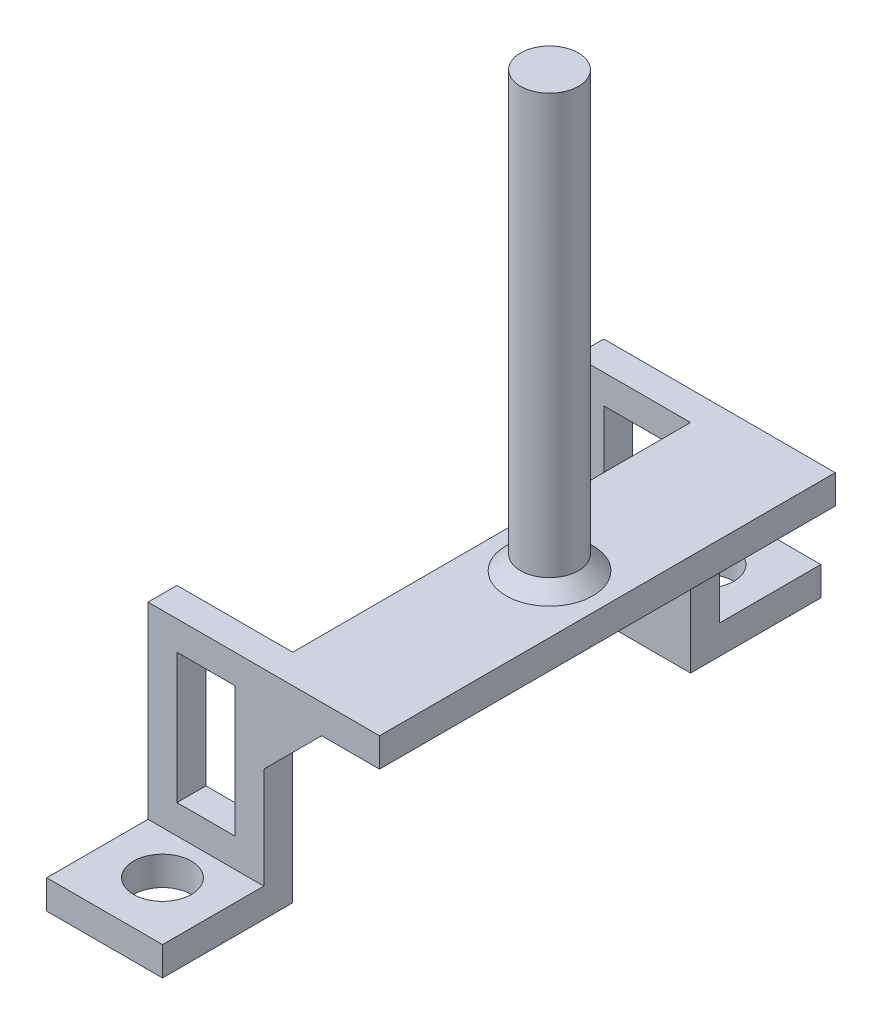
ISO-10303-21;
HEADER;
FILE_DESCRIPTION(('STEP AP214'),'2;1');
FILE_NAME('part.step','',(''),(''),'','','');
FILE_SCHEMA(('AUTOMOTIVE_DESIGN { 1 0 10303 214 1 1 1 1 }'));
ENDSEC;
DATA;
#1=APPLICATION_CONTEXT('core data for automotive mechanical design processes');
#2=APPLICATION_PROTOCOL_DEFINITION('international standard','automotive_design',2000,#1);
#3=PRODUCT_CONTEXT('',#1,'mechanical');
#4=PRODUCT('Part','Part','',(#3));
#5=PRODUCT_RELATED_PRODUCT_CATEGORY('part','',(#4));
#6=PRODUCT_DEFINITION_FORMATION('','',#4);
#7=PRODUCT_DEFINITION_CONTEXT('part definition',#1,'design');
#8=PRODUCT_DEFINITION('design','',#6,#7);
#9=PRODUCT_DEFINITION_SHAPE('','',#8);
#10=(LENGTH_UNIT() NAMED_UNIT(*) SI_UNIT(.MILLI.,.METRE.));
#11=(NAMED_UNIT(*) PLANE_ANGLE_UNIT() SI_UNIT($,.RADIAN.));
#12=(NAMED_UNIT(*) SI_UNIT($,.STERADIAN.) SOLID_ANGLE_UNIT());
#13=UNCERTAINTY_MEASURE_WITH_UNIT(LENGTH_MEASURE(1.E-05),#10,'distance_accuracy_value','');
#14=(GEOMETRIC_REPRESENTATION_CONTEXT(3) GLOBAL_UNCERTAINTY_ASSIGNED_CONTEXT((#13)) GLOBAL_UNIT_ASSIGNED_CONTEXT((#10,
#11,#12)) REPRESENTATION_CONTEXT('',''));
#15=CARTESIAN_POINT('',(0.,0.,0.));
#16=DIRECTION('',(0.,0.,1.));
#17=DIRECTION('',(1.,0.,0.));
#18=AXIS2_PLACEMENT_3D('',#15,#16,#17);
#19=CARTESIAN_POINT('',(4.,2.,-4.));
#20=DIRECTION('',(-1.,0.,0.));
#21=DIRECTION('',(0.,0.,1.));
#22=AXIS2_PLACEMENT_3D('',#19,#20,#21);
#23=PLANE('',#22);
#24=DIRECTION('',(0.,-1.,0.));
#25=VECTOR('',#24,1.);
#26=CARTESIAN_POINT('',(4.,15.,-5.));
#27=LINE('',#26,#25);
#28=CARTESIAN_POINT('',(4.,9.00000000000001,-5.));
#29=VERTEX_POINT('',#28);
#30=CARTESIAN_POINT('',(4.,0.,-5.));
#31=VERTEX_POINT('',#30);
#32=EDGE_CURVE('E348',#29,#31,#27,.T.);
#33=ORIENTED_EDGE('',*,*,#32,.F.);
#34=DIRECTION('',(0.,0.,1.));
#35=VECTOR('',#34,1.);
#36=CARTESIAN_POINT('',(4.,9.00000000000001,-3.));
#37=LINE('',#36,#35);
#38=CARTESIAN_POINT('',(4.,9.00000000000001,-3.));
#39=VERTEX_POINT('',#38);
#40=EDGE_CURVE('E392',#29,#39,#37,.T.);
#41=ORIENTED_EDGE('',*,*,#40,.T.);
#42=DIRECTION('',(0.,-1.,0.));
#43=VECTOR('',#42,1.);
#44=CARTESIAN_POINT('',(4.,15.,-3.));
#45=LINE('',#44,#43);
#46=CARTESIAN_POINT('',(4.,2.,-3.));
#47=VERTEX_POINT('',#46);
#48=EDGE_CURVE('E343',#39,#47,#45,.T.);
#49=ORIENTED_EDGE('',*,*,#48,.T.);
#50=DIRECTION('',(0.,0.,-1.));
#51=VECTOR('',#50,1.);
#52=CARTESIAN_POINT('',(4.,2.,-4.));
#53=LINE('',#52,#51);
#54=CARTESIAN_POINT('',(4.,2.,4.));
#55=VERTEX_POINT('',#54);
#56=EDGE_CURVE('E360',#55,#47,#53,.T.);
#57=ORIENTED_EDGE('',*,*,#56,.F.);
#58=DIRECTION('',(0.,-1.,0.));
#59=VECTOR('',#58,1.);
#60=CARTESIAN_POINT('',(4.,2.,4.));
#61=LINE('',#60,#59);
#62=CARTESIAN_POINT('',(4.,0.,4.));
#63=VERTEX_POINT('',#62);
#64=EDGE_CURVE('E368',#55,#63,#61,.T.);
#65=ORIENTED_EDGE('',*,*,#64,.T.);
#66=DIRECTION('',(0.,0.,-1.));
#67=VECTOR('',#66,1.);
#68=CARTESIAN_POINT('',(4.,0.,-4.));
#69=LINE('',#68,#67);
#70=EDGE_CURVE('E357',#63,#31,#69,.T.);
#71=ORIENTED_EDGE('',*,*,#70,.T.);
#72=EDGE_LOOP('',(#33,#41,#49,#57,#65,#71));
#73=FACE_BOUND('',#72,.T.);
#74=ADVANCED_FACE('F33',(#73),#23,.F.);
#75=CARTESIAN_POINT('',(0.,2.,0.));
#76=DIRECTION('',(0.,1.,0.));
#77=DIRECTION('',(0.,0.,1.));
#78=AXIS2_PLACEMENT_3D('',#75,#76,#77);
#79=PLANE('',#78);
#80=DIRECTION('',(1.,0.,0.));
#81=VECTOR('',#80,1.);
#82=CARTESIAN_POINT('',(0.,2.,-3.));
#83=LINE('',#82,#81);
#84=CARTESIAN_POINT('',(-4.,2.,-3.));
#85=VERTEX_POINT('',#84);
#86=EDGE_CURVE('E342',#85,#47,#83,.T.);
#87=ORIENTED_EDGE('',*,*,#86,.F.);
#88=DIRECTION('',(0.,0.,1.));
#89=VECTOR('',#88,1.);
#90=CARTESIAN_POINT('',(-4.,2.,-4.));
#91=LINE('',#90,#89);
#92=CARTESIAN_POINT('',(-4.,2.,4.));
#93=VERTEX_POINT('',#92);
#94=EDGE_CURVE('E363',#85,#93,#91,.T.);
#95=ORIENTED_EDGE('',*,*,#94,.T.);
#96=DIRECTION('',(1.,0.,0.));
#97=VECTOR('',#96,1.);
#98=CARTESIAN_POINT('',(-4.,2.,4.));
#99=LINE('',#98,#97);
#100=EDGE_CURVE('E366',#93,#55,#99,.T.);
#101=ORIENTED_EDGE('',*,*,#100,.T.);
#102=ORIENTED_EDGE('',*,*,#56,.T.);
#103=EDGE_LOOP('',(#87,#95,#101,#102));
#104=FACE_BOUND('',#103,.T.);
#105=CARTESIAN_POINT('',(0.,2.,0.));
#106=DIRECTION('',(0.,1.,0.));
#107=DIRECTION('',(0.,0.,1.));
#108=AXIS2_PLACEMENT_3D('',#105,#106,#107);
#109=CIRCLE('',#108,2.);
#110=CARTESIAN_POINT('',(0.,2.,2.));
#111=VERTEX_POINT('',#110);
#112=EDGE_CURVE('E354',#111,#111,#109,.T.);
#113=ORIENTED_EDGE('',*,*,#112,.F.);
#114=EDGE_LOOP('',(#113));
#115=FACE_BOUND('',#114,.T.);
#116=ADVANCED_FACE('F426',(#104,#115),#79,.T.);
#117=CARTESIAN_POINT('',(0.,0.,0.));
#118=DIRECTION('',(0.,1.,0.));
#119=DIRECTION('',(0.,0.,1.));
#120=AXIS2_PLACEMENT_3D('',#117,#118,#119);
#121=PLANE('',#120);
#122=DIRECTION('',(1.,0.,0.));
#123=VECTOR('',#122,1.);
#124=CARTESIAN_POINT('',(-4.,0.,4.));
#125=LINE('',#124,#123);
#126=CARTESIAN_POINT('',(-4.,0.,4.));
#127=VERTEX_POINT('',#126);
#128=EDGE_CURVE('E364',#127,#63,#125,.T.);
#129=ORIENTED_EDGE('',*,*,#128,.F.);
#130=DIRECTION('',(0.,0.,1.));
#131=VECTOR('',#130,1.);
#132=CARTESIAN_POINT('',(-4.,0.,-4.));
#133=LINE('',#132,#131);
#134=CARTESIAN_POINT('',(-4.,0.,-5.));
#135=VERTEX_POINT('',#134);
#136=EDGE_CURVE('E371',#135,#127,#133,.T.);
#137=ORIENTED_EDGE('',*,*,#136,.F.);
#138=DIRECTION('',(1.,0.,0.));
#139=VECTOR('',#138,1.);
#140=CARTESIAN_POINT('',(-4.,0.,-5.));
#141=LINE('',#140,#139);
#142=EDGE_CURVE('E320',#135,#31,#141,.T.);
#143=ORIENTED_EDGE('',*,*,#142,.T.);
#144=ORIENTED_EDGE('',*,*,#70,.F.);
#145=EDGE_LOOP('',(#129,#137,#143,#144));
#146=FACE_BOUND('',#145,.T.);
#147=CARTESIAN_POINT('',(0.,0.,0.));
#148=DIRECTION('',(0.,1.,0.));
#149=DIRECTION('',(0.,0.,1.));
#150=AXIS2_PLACEMENT_3D('',#147,#148,#149);
#151=CIRCLE('',#150,2.);
#152=CARTESIAN_POINT('',(0.,0.,2.));
#153=VERTEX_POINT('',#152);
#154=EDGE_CURVE('E353',#153,#153,#151,.T.);
#155=ORIENTED_EDGE('',*,*,#154,.T.);
#156=EDGE_LOOP('',(#155));
#157=FACE_BOUND('',#156,.T.);
#158=ADVANCED_FACE('F434',(#146,#157),#121,.F.);
#159=CARTESIAN_POINT('',(-4.,2.,-4.));
#160=DIRECTION('',(1.,0.,0.));
#161=DIRECTION('',(0.,0.,-1.));
#162=AXIS2_PLACEMENT_3D('',#159,#160,#161);
#163=PLANE('',#162);
#164=ORIENTED_EDGE('',*,*,#94,.F.);
#165=DIRECTION('',(0.,-1.,0.));
#166=VECTOR('',#165,1.);
#167=CARTESIAN_POINT('',(-4.,15.,-3.));
#168=LINE('',#167,#166);
#169=CARTESIAN_POINT('',(-4.,15.,-3.));
#170=VERTEX_POINT('',#169);
#171=EDGE_CURVE('E339',#170,#85,#168,.T.);
#172=ORIENTED_EDGE('',*,*,#171,.F.);
#173=DIRECTION('',(0.,0.,-1.));
#174=VECTOR('',#173,1.);
#175=CARTESIAN_POINT('',(-4.,15.,-3.));
#176=LINE('',#175,#174);
#177=CARTESIAN_POINT('',(-4.,15.,-5.));
#178=VERTEX_POINT('',#177);
#179=EDGE_CURVE('E328',#170,#178,#176,.T.);
#180=ORIENTED_EDGE('',*,*,#179,.T.);
#181=DIRECTION('',(0.,-1.,0.));
#182=VECTOR('',#181,1.);
#183=CARTESIAN_POINT('',(-4.,15.,-5.));
#184=LINE('',#183,#182);
#185=EDGE_CURVE('E336',#178,#135,#184,.T.);
#186=ORIENTED_EDGE('',*,*,#185,.T.);
#187=ORIENTED_EDGE('',*,*,#136,.T.);
#188=DIRECTION('',(0.,-1.,0.));
#189=VECTOR('',#188,1.);
#190=CARTESIAN_POINT('',(-4.,2.,4.));
#191=LINE('',#190,#189);
#192=EDGE_CURVE('E376',#93,#127,#191,.T.);
#193=ORIENTED_EDGE('',*,*,#192,.F.);
#194=EDGE_LOOP('',(#164,#172,#180,#186,#187,#193));
#195=FACE_BOUND('',#194,.T.);
#196=ADVANCED_FACE('F440',(#195),#163,.F.);
#197=CARTESIAN_POINT('',(-4.,2.,4.));
#198=DIRECTION('',(0.,0.,-1.));
#199=DIRECTION('',(-1.,0.,0.));
#200=AXIS2_PLACEMENT_3D('',#197,#198,#199);
#201=PLANE('',#200);
#202=ORIENTED_EDGE('',*,*,#128,.T.);
#203=ORIENTED_EDGE('',*,*,#64,.F.);
#204=ORIENTED_EDGE('',*,*,#100,.F.);
#205=ORIENTED_EDGE('',*,*,#192,.T.);
#206=EDGE_LOOP('',(#202,#203,#204,#205));
#207=FACE_BOUND('',#206,.T.);
#208=ADVANCED_FACE('F503',(#207),#201,.F.);
#209=CARTESIAN_POINT('',(0.,2.,0.));
#210=DIRECTION('',(0.,-1.,0.));
#211=DIRECTION('',(0.,0.,-1.));
#212=AXIS2_PLACEMENT_3D('',#209,#210,#211);
#213=CYLINDRICAL_SURFACE('',#212,2.);
#214=ORIENTED_EDGE('',*,*,#112,.T.);
#215=EDGE_LOOP('',(#214));
#216=FACE_BOUND('',#215,.T.);
#217=ORIENTED_EDGE('',*,*,#154,.F.);
#218=EDGE_LOOP('',(#217));
#219=FACE_BOUND('',#218,.T.);
#220=ADVANCED_FACE('F507',(#216,#219),#213,.F.);
#221=CARTESIAN_POINT('',(-4.,15.,-3.));
#222=DIRECTION('',(0.,0.,1.));
#223=DIRECTION('',(1.,0.,0.));
#224=AXIS2_PLACEMENT_3D('',#221,#222,#223);
#225=PLANE('',#224);
#226=DIRECTION('',(0.,1.,0.));
#227=VECTOR('',#226,1.);
#228=CARTESIAN_POINT('',(2.,4.,-3.));
#229=LINE('',#228,#227);
#230=CARTESIAN_POINT('',(2.,4.,-3.));
#231=VERTEX_POINT('',#230);
#232=CARTESIAN_POINT('',(2.,13.,-3.));
#233=VERTEX_POINT('',#232);
#234=EDGE_CURVE('E48',#231,#233,#229,.T.);
#235=ORIENTED_EDGE('',*,*,#234,.F.);
#236=DIRECTION('',(1.,0.,0.));
#237=VECTOR('',#236,1.);
#238=CARTESIAN_POINT('',(-2.,4.,-3.));
#239=LINE('',#238,#237);
#240=CARTESIAN_POINT('',(-2.,4.,-3.));
#241=VERTEX_POINT('',#240);
#242=EDGE_CURVE('E226',#241,#231,#239,.T.);
#243=ORIENTED_EDGE('',*,*,#242,.F.);
#244=DIRECTION('',(0.,-1.,0.));
#245=VECTOR('',#244,1.);
#246=CARTESIAN_POINT('',(-2.,4.,-3.));
#247=LINE('',#246,#245);
#248=CARTESIAN_POINT('',(-2.,13.,-3.));
#249=VERTEX_POINT('',#248);
#250=EDGE_CURVE('E209',#249,#241,#247,.T.);
#251=ORIENTED_EDGE('',*,*,#250,.F.);
#252=DIRECTION('',(-1.,0.,0.));
#253=VECTOR('',#252,1.);
#254=CARTESIAN_POINT('',(-2.,13.,-3.));
#255=LINE('',#254,#253);
#256=EDGE_CURVE('E218',#233,#249,#255,.T.);
#257=ORIENTED_EDGE('',*,*,#256,.F.);
#258=EDGE_LOOP('',(#235,#243,#251,#257));
#259=FACE_BOUND('',#258,.T.);
#260=ORIENTED_EDGE('',*,*,#171,.T.);
#261=ORIENTED_EDGE('',*,*,#86,.T.);
#262=ORIENTED_EDGE('',*,*,#48,.F.);
#263=DIRECTION('',(-0.707106781186551,-0.707106781186544,0.));
#264=VECTOR('',#263,1.);
#265=CARTESIAN_POINT('',(8.00000000000003,13.,-3.));
#266=LINE('',#265,#264);
#267=CARTESIAN_POINT('',(8.00000000000003,13.,-3.));
#268=VERTEX_POINT('',#267);
#269=EDGE_CURVE('E400',#39,#268,#266,.F.);
#270=ORIENTED_EDGE('',*,*,#269,.T.);
#271=DIRECTION('',(1.,0.,0.));
#272=VECTOR('',#271,1.);
#273=CARTESIAN_POINT('',(4.,13.,-3.));
#274=LINE('',#273,#272);
#275=CARTESIAN_POINT('',(12.,13.,-3.));
#276=VERTEX_POINT('',#275);
#277=EDGE_CURVE('E308',#268,#276,#274,.T.);
#278=ORIENTED_EDGE('',*,*,#277,.T.);
#279=DIRECTION('',(0.,1.,0.));
#280=VECTOR('',#279,1.);
#281=CARTESIAN_POINT('',(12.,15.,-3.));
#282=LINE('',#281,#280);
#283=CARTESIAN_POINT('',(12.,15.,-3.));
#284=VERTEX_POINT('',#283);
#285=EDGE_CURVE('E317',#276,#284,#282,.T.);
#286=ORIENTED_EDGE('',*,*,#285,.T.);
#287=DIRECTION('',(-1.,0.,0.));
#288=VECTOR('',#287,1.);
#289=CARTESIAN_POINT('',(-4.,15.,-3.));
#290=LINE('',#289,#288);
#291=EDGE_CURVE('E333',#284,#170,#290,.T.);
#292=ORIENTED_EDGE('',*,*,#291,.T.);
#293=EDGE_LOOP('',(#260,#261,#262,#270,#278,#286,#292));
#294=FACE_BOUND('',#293,.T.);
#295=ADVANCED_FACE('F223',(#259,#294),#225,.T.);
#296=CARTESIAN_POINT('',(-4.,15.,-5.));
#297=DIRECTION('',(0.,0.,-1.));
#298=DIRECTION('',(-1.,0.,0.));
#299=AXIS2_PLACEMENT_3D('',#296,#297,#298);
#300=PLANE('',#299);
#301=DIRECTION('',(0.,-1.,0.));
#302=VECTOR('',#301,1.);
#303=CARTESIAN_POINT('',(2.,15.,-5.));
#304=LINE('',#303,#302);
#305=CARTESIAN_POINT('',(2.,13.,-5.00000000000002));
#306=VERTEX_POINT('',#305);
#307=CARTESIAN_POINT('',(2.,4.,-5.00000000000002));
#308=VERTEX_POINT('',#307);
#309=EDGE_CURVE('E255',#306,#308,#304,.T.);
#310=ORIENTED_EDGE('',*,*,#309,.F.);
#311=DIRECTION('',(1.,0.,0.));
#312=VECTOR('',#311,1.);
#313=CARTESIAN_POINT('',(-4.,13.,-5.));
#314=LINE('',#313,#312);
#315=CARTESIAN_POINT('',(-2.,13.,-5.));
#316=VERTEX_POINT('',#315);
#317=EDGE_CURVE('E241',#316,#306,#314,.T.);
#318=ORIENTED_EDGE('',*,*,#317,.F.);
#319=DIRECTION('',(0.,1.,0.));
#320=VECTOR('',#319,1.);
#321=CARTESIAN_POINT('',(-2.,15.,-5.));
#322=LINE('',#321,#320);
#323=CARTESIAN_POINT('',(-2.,4.,-5.00000000000002));
#324=VERTEX_POINT('',#323);
#325=EDGE_CURVE('E212',#324,#316,#322,.T.);
#326=ORIENTED_EDGE('',*,*,#325,.F.);
#327=DIRECTION('',(-1.,0.,0.));
#328=VECTOR('',#327,1.);
#329=CARTESIAN_POINT('',(-4.,4.,-5.));
#330=LINE('',#329,#328);
#331=EDGE_CURVE('E250',#308,#324,#330,.T.);
#332=ORIENTED_EDGE('',*,*,#331,.F.);
#333=EDGE_LOOP('',(#310,#318,#326,#332));
#334=FACE_BOUND('',#333,.T.);
#335=ORIENTED_EDGE('',*,*,#142,.F.);
#336=ORIENTED_EDGE('',*,*,#185,.F.);
#337=DIRECTION('',(1.,0.,0.));
#338=VECTOR('',#337,1.);
#339=CARTESIAN_POINT('',(-4.,15.,-5.));
#340=LINE('',#339,#338);
#341=CARTESIAN_POINT('',(4.,15.,-5.));
#342=VERTEX_POINT('',#341);
#343=EDGE_CURVE('E331',#178,#342,#340,.T.);
#344=ORIENTED_EDGE('',*,*,#343,.T.);
#345=CARTESIAN_POINT('',(4.,13.,-5.));
#346=VERTEX_POINT('',#345);
#347=EDGE_CURVE('E345',#342,#346,#27,.T.);
#348=ORIENTED_EDGE('',*,*,#347,.T.);
#349=DIRECTION('',(-1.,0.,0.));
#350=VECTOR('',#349,1.);
#351=CARTESIAN_POINT('',(4.,13.,-5.));
#352=LINE('',#351,#350);
#353=CARTESIAN_POINT('',(8.00000000000003,13.,-5.));
#354=VERTEX_POINT('',#353);
#355=EDGE_CURVE('E382',#354,#346,#352,.T.);
#356=ORIENTED_EDGE('',*,*,#355,.F.);
#357=DIRECTION('',(0.707106781186551,0.707106781186544,0.));
#358=VECTOR('',#357,1.);
#359=CARTESIAN_POINT('',(8.00000000000003,13.,-5.00000000000001));
#360=LINE('',#359,#358);
#361=EDGE_CURVE('E398',#354,#29,#360,.F.);
#362=ORIENTED_EDGE('',*,*,#361,.T.);
#363=ORIENTED_EDGE('',*,*,#32,.T.);
#364=EDGE_LOOP('',(#335,#336,#344,#348,#356,#362,#363));
#365=FACE_BOUND('',#364,.T.);
#366=ADVANCED_FACE('F488',(#334,#365),#300,.T.);
#367=CARTESIAN_POINT('',(0.,15.,0.));
#368=DIRECTION('',(0.,-1.,0.));
#369=DIRECTION('',(0.,0.,-1.));
#370=AXIS2_PLACEMENT_3D('',#367,#368,#369);
#371=PLANE('',#370);
#372=CARTESIAN_POINT('',(8.,15.,-18.75));
#373=DIRECTION('',(0.,-1.,0.));
#374=DIRECTION('',(0.,0.,-1.));
#375=AXIS2_PLACEMENT_3D('',#372,#373,#374);
#376=CIRCLE('',#375,2.99999999999999);
#377=CARTESIAN_POINT('',(8.,15.,-21.75));
#378=VERTEX_POINT('',#377);
#379=EDGE_CURVE('E11',#378,#378,#376,.T.);
#380=ORIENTED_EDGE('',*,*,#379,.T.);
#381=EDGE_LOOP('',(#380));
#382=FACE_BOUND('',#381,.T.);
#383=ORIENTED_EDGE('',*,*,#179,.F.);
#384=ORIENTED_EDGE('',*,*,#291,.F.);
#385=DIRECTION('',(0.,0.,-1.));
#386=VECTOR('',#385,1.);
#387=CARTESIAN_POINT('',(12.,15.,5.24621125123532));
#388=LINE('',#387,#386);
#389=CARTESIAN_POINT('',(12.,15.,-34.5));
#390=VERTEX_POINT('',#389);
#391=EDGE_CURVE('E309',#284,#390,#388,.T.);
#392=ORIENTED_EDGE('',*,*,#391,.T.);
#393=DIRECTION('',(-1.,0.,0.));
#394=VECTOR('',#393,1.);
#395=CARTESIAN_POINT('',(4.,15.,-34.5));
#396=LINE('',#395,#394);
#397=CARTESIAN_POINT('',(-4.,15.,-34.5));
#398=VERTEX_POINT('',#397);
#399=EDGE_CURVE('E306',#390,#398,#396,.T.);
#400=ORIENTED_EDGE('',*,*,#399,.T.);
#401=DIRECTION('',(0.,0.,-1.));
#402=VECTOR('',#401,1.);
#403=CARTESIAN_POINT('',(-4.,15.,-34.5));
#404=LINE('',#403,#402);
#405=CARTESIAN_POINT('',(-4.,15.,-32.5));
#406=VERTEX_POINT('',#405);
#407=EDGE_CURVE('E258',#406,#398,#404,.T.);
#408=ORIENTED_EDGE('',*,*,#407,.F.);
#409=DIRECTION('',(-1.,0.,0.));
#410=VECTOR('',#409,1.);
#411=CARTESIAN_POINT('',(-4.,15.,-32.5));
#412=LINE('',#411,#410);
#413=CARTESIAN_POINT('',(4.,15.,-32.5));
#414=VERTEX_POINT('',#413);
#415=EDGE_CURVE('E261',#414,#406,#412,.T.);
#416=ORIENTED_EDGE('',*,*,#415,.F.);
#417=DIRECTION('',(0.,0.,-1.));
#418=VECTOR('',#417,1.);
#419=CARTESIAN_POINT('',(4.,15.,5.24621125123532));
#420=LINE('',#419,#418);
#421=EDGE_CURVE('E305',#342,#414,#420,.T.);
#422=ORIENTED_EDGE('',*,*,#421,.F.);
#423=ORIENTED_EDGE('',*,*,#343,.F.);
#424=EDGE_LOOP('',(#383,#384,#392,#400,#408,#416,#422,#423));
#425=FACE_BOUND('',#424,.T.);
#426=ADVANCED_FACE('F478',(#382,#425),#371,.F.);
#427=CARTESIAN_POINT('',(4.,15.,5.24621125123532));
#428=DIRECTION('',(1.,0.,0.));
#429=DIRECTION('',(0.,0.,-1.));
#430=AXIS2_PLACEMENT_3D('',#427,#428,#429);
#431=PLANE('',#430);
#432=ORIENTED_EDGE('',*,*,#421,.T.);
#433=DIRECTION('',(0.,-1.,0.));
#434=VECTOR('',#433,1.);
#435=CARTESIAN_POINT('',(4.,15.,-32.5));
#436=LINE('',#435,#434);
#437=CARTESIAN_POINT('',(4.,13.,-32.5));
#438=VERTEX_POINT('',#437);
#439=EDGE_CURVE('E271',#414,#438,#436,.T.);
#440=ORIENTED_EDGE('',*,*,#439,.T.);
#441=DIRECTION('',(0.,0.,-1.));
#442=VECTOR('',#441,1.);
#443=CARTESIAN_POINT('',(4.,13.,5.24621125123532));
#444=LINE('',#443,#442);
#445=EDGE_CURVE('E316',#346,#438,#444,.T.);
#446=ORIENTED_EDGE('',*,*,#445,.F.);
#447=ORIENTED_EDGE('',*,*,#347,.F.);
#448=EDGE_LOOP('',(#432,#440,#446,#447));
#449=FACE_BOUND('',#448,.T.);
#450=ADVANCED_FACE('F492',(#449),#431,.F.);
#451=CARTESIAN_POINT('',(4.,13.,5.24621125123532));
#452=DIRECTION('',(0.,1.,0.));
#453=DIRECTION('',(0.,0.,1.));
#454=AXIS2_PLACEMENT_3D('',#451,#452,#453);
#455=PLANE('',#454);
#456=ORIENTED_EDGE('',*,*,#445,.T.);
#457=DIRECTION('',(1.,0.,0.));
#458=VECTOR('',#457,1.);
#459=CARTESIAN_POINT('',(4.,13.,-32.5));
#460=LINE('',#459,#458);
#461=CARTESIAN_POINT('',(8.,13.,-32.5));
#462=VERTEX_POINT('',#461);
#463=EDGE_CURVE('E389',#438,#462,#460,.T.);
#464=ORIENTED_EDGE('',*,*,#463,.T.);
#465=DIRECTION('',(0.,0.,-1.));
#466=VECTOR('',#465,1.);
#467=CARTESIAN_POINT('',(8.,13.,-34.5));
#468=LINE('',#467,#466);
#469=CARTESIAN_POINT('',(8.,13.,-34.5));
#470=VERTEX_POINT('',#469);
#471=EDGE_CURVE('E387',#462,#470,#468,.T.);
#472=ORIENTED_EDGE('',*,*,#471,.T.);
#473=DIRECTION('',(1.,0.,0.));
#474=VECTOR('',#473,1.);
#475=CARTESIAN_POINT('',(4.,13.,-34.5));
#476=LINE('',#475,#474);
#477=CARTESIAN_POINT('',(12.,13.,-34.5));
#478=VERTEX_POINT('',#477);
#479=EDGE_CURVE('E314',#470,#478,#476,.T.);
#480=ORIENTED_EDGE('',*,*,#479,.T.);
#481=DIRECTION('',(0.,0.,-1.));
#482=VECTOR('',#481,1.);
#483=CARTESIAN_POINT('',(12.,13.,5.24621125123532));
#484=LINE('',#483,#482);
#485=EDGE_CURVE('E313',#276,#478,#484,.T.);
#486=ORIENTED_EDGE('',*,*,#485,.F.);
#487=ORIENTED_EDGE('',*,*,#277,.F.);
#488=DIRECTION('',(0.,0.,-1.));
#489=VECTOR('',#488,1.);
#490=CARTESIAN_POINT('',(8.00000000000003,13.,-5.));
#491=LINE('',#490,#489);
#492=EDGE_CURVE('E384',#268,#354,#491,.T.);
#493=ORIENTED_EDGE('',*,*,#492,.T.);
#494=ORIENTED_EDGE('',*,*,#355,.T.);
#495=EDGE_LOOP('',(#456,#464,#472,#480,#486,#487,#493,#494));
#496=FACE_BOUND('',#495,.T.);
#497=ADVANCED_FACE('F464',(#496),#455,.F.);
#498=CARTESIAN_POINT('',(12.,15.,5.24621125123532));
#499=DIRECTION('',(-1.,0.,0.));
#500=DIRECTION('',(0.,0.,1.));
#501=AXIS2_PLACEMENT_3D('',#498,#499,#500);
#502=PLANE('',#501);
#503=ORIENTED_EDGE('',*,*,#285,.F.);
#504=ORIENTED_EDGE('',*,*,#485,.T.);
#505=DIRECTION('',(0.,1.,0.));
#506=VECTOR('',#505,1.);
#507=CARTESIAN_POINT('',(12.,15.,-34.5));
#508=LINE('',#507,#506);
#509=EDGE_CURVE('E310',#478,#390,#508,.T.);
#510=ORIENTED_EDGE('',*,*,#509,.T.);
#511=ORIENTED_EDGE('',*,*,#391,.F.);
#512=EDGE_LOOP('',(#503,#504,#510,#511));
#513=FACE_BOUND('',#512,.T.);
#514=ADVANCED_FACE('F468',(#513),#502,.F.);
#515=CARTESIAN_POINT('',(0.,0.,-34.5));
#516=DIRECTION('',(0.,0.,1.));
#517=DIRECTION('',(1.,0.,0.));
#518=AXIS2_PLACEMENT_3D('',#515,#516,#517);
#519=PLANE('',#518);
#520=DIRECTION('',(1.,0.,0.));
#521=VECTOR('',#520,1.);
#522=CARTESIAN_POINT('',(0.,4.,-34.5));
#523=LINE('',#522,#521);
#524=CARTESIAN_POINT('',(-2.,4.,-34.5));
#525=VERTEX_POINT('',#524);
#526=CARTESIAN_POINT('',(2.,4.,-34.5));
#527=VERTEX_POINT('',#526);
#528=EDGE_CURVE('E247',#525,#527,#523,.T.);
#529=ORIENTED_EDGE('',*,*,#528,.T.);
#530=DIRECTION('',(0.,1.,0.));
#531=VECTOR('',#530,1.);
#532=CARTESIAN_POINT('',(2.,0.,-34.5));
#533=LINE('',#532,#531);
#534=CARTESIAN_POINT('',(2.,13.,-34.5));
#535=VERTEX_POINT('',#534);
#536=EDGE_CURVE('E252',#527,#535,#533,.T.);
#537=ORIENTED_EDGE('',*,*,#536,.T.);
#538=DIRECTION('',(-1.,0.,0.));
#539=VECTOR('',#538,1.);
#540=CARTESIAN_POINT('',(0.,13.,-34.5));
#541=LINE('',#540,#539);
#542=CARTESIAN_POINT('',(-2.,13.,-34.5));
#543=VERTEX_POINT('',#542);
#544=EDGE_CURVE('E238',#535,#543,#541,.T.);
#545=ORIENTED_EDGE('',*,*,#544,.T.);
#546=DIRECTION('',(0.,-1.,0.));
#547=VECTOR('',#546,1.);
#548=CARTESIAN_POINT('',(-2.,0.,-34.5));
#549=LINE('',#548,#547);
#550=EDGE_CURVE('E243',#543,#525,#549,.T.);
#551=ORIENTED_EDGE('',*,*,#550,.T.);
#552=EDGE_LOOP('',(#529,#537,#545,#551));
#553=FACE_BOUND('',#552,.T.);
#554=ORIENTED_EDGE('',*,*,#479,.F.);
#555=DIRECTION('',(0.707106781186544,0.707106781186551,0.));
#556=VECTOR('',#555,1.);
#557=CARTESIAN_POINT('',(-2.49999999999996,2.49999999999993,-34.5));
#558=LINE('',#557,#556);
#559=CARTESIAN_POINT('',(4.,8.99999999999996,-34.5));
#560=VERTEX_POINT('',#559);
#561=EDGE_CURVE('E396',#470,#560,#558,.F.);
#562=ORIENTED_EDGE('',*,*,#561,.T.);
#563=DIRECTION('',(0.,-1.,0.));
#564=VECTOR('',#563,1.);
#565=CARTESIAN_POINT('',(4.,15.,-34.5));
#566=LINE('',#565,#564);
#567=CARTESIAN_POINT('',(4.,2.,-34.5));
#568=VERTEX_POINT('',#567);
#569=EDGE_CURVE('E275',#560,#568,#566,.T.);
#570=ORIENTED_EDGE('',*,*,#569,.T.);
#571=DIRECTION('',(-1.,0.,0.));
#572=VECTOR('',#571,1.);
#573=CARTESIAN_POINT('',(0.,2.,-34.5));
#574=LINE('',#573,#572);
#575=CARTESIAN_POINT('',(-4.,2.,-34.5));
#576=VERTEX_POINT('',#575);
#577=EDGE_CURVE('E270',#568,#576,#574,.T.);
#578=ORIENTED_EDGE('',*,*,#577,.T.);
#579=DIRECTION('',(0.,-1.,0.));
#580=VECTOR('',#579,1.);
#581=CARTESIAN_POINT('',(-4.,15.,-34.5));
#582=LINE('',#581,#580);
#583=EDGE_CURVE('E264',#398,#576,#582,.T.);
#584=ORIENTED_EDGE('',*,*,#583,.F.);
#585=ORIENTED_EDGE('',*,*,#399,.F.);
#586=ORIENTED_EDGE('',*,*,#509,.F.);
#587=EDGE_LOOP('',(#554,#562,#570,#578,#584,#585,#586));
#588=FACE_BOUND('',#587,.T.);
#589=ADVANCED_FACE('F472',(#553,#588),#519,.F.);
#590=CARTESIAN_POINT('',(4.,2.,-41.5));
#591=DIRECTION('',(-1.,0.,0.));
#592=DIRECTION('',(0.,0.,1.));
#593=AXIS2_PLACEMENT_3D('',#590,#591,#592);
#594=PLANE('',#593);
#595=ORIENTED_EDGE('',*,*,#569,.F.);
#596=DIRECTION('',(0.,0.,1.));
#597=VECTOR('',#596,1.);
#598=CARTESIAN_POINT('',(4.,8.99999999999996,-32.5));
#599=LINE('',#598,#597);
#600=CARTESIAN_POINT('',(4.,8.99999999999996,-32.5));
#601=VERTEX_POINT('',#600);
#602=EDGE_CURVE('E379',#560,#601,#599,.T.);
#603=ORIENTED_EDGE('',*,*,#602,.T.);
#604=CARTESIAN_POINT('',(4.,0.,-32.5));
#605=VERTEX_POINT('',#604);
#606=EDGE_CURVE('E274',#601,#605,#436,.T.);
#607=ORIENTED_EDGE('',*,*,#606,.T.);
#608=DIRECTION('',(0.,0.,-1.));
#609=VECTOR('',#608,1.);
#610=CARTESIAN_POINT('',(4.,0.,-41.5));
#611=LINE('',#610,#609);
#612=CARTESIAN_POINT('',(4.,0.,-41.5));
#613=VERTEX_POINT('',#612);
#614=EDGE_CURVE('E285',#605,#613,#611,.T.);
#615=ORIENTED_EDGE('',*,*,#614,.T.);
#616=DIRECTION('',(0.,-1.,0.));
#617=VECTOR('',#616,1.);
#618=CARTESIAN_POINT('',(4.,2.,-41.5));
#619=LINE('',#618,#617);
#620=CARTESIAN_POINT('',(4.,2.,-41.5));
#621=VERTEX_POINT('',#620);
#622=EDGE_CURVE('E302',#621,#613,#619,.T.);
#623=ORIENTED_EDGE('',*,*,#622,.F.);
#624=DIRECTION('',(0.,0.,-1.));
#625=VECTOR('',#624,1.);
#626=CARTESIAN_POINT('',(4.,2.,-41.5));
#627=LINE('',#626,#625);
#628=EDGE_CURVE('E288',#568,#621,#627,.T.);
#629=ORIENTED_EDGE('',*,*,#628,.F.);
#630=EDGE_LOOP('',(#595,#603,#607,#615,#623,#629));
#631=FACE_BOUND('',#630,.T.);
#632=ADVANCED_FACE('F535',(#631),#594,.F.);
#633=CARTESIAN_POINT('',(0.,2.,0.));
#634=DIRECTION('',(0.,1.,0.));
#635=DIRECTION('',(0.,0.,1.));
#636=AXIS2_PLACEMENT_3D('',#633,#634,#635);
#637=PLANE('',#636);
#638=ORIENTED_EDGE('',*,*,#577,.F.);
#639=ORIENTED_EDGE('',*,*,#628,.T.);
#640=DIRECTION('',(-1.,0.,0.));
#641=VECTOR('',#640,1.);
#642=CARTESIAN_POINT('',(-4.,2.,-41.5));
#643=LINE('',#642,#641);
#644=CARTESIAN_POINT('',(-4.,2.,-41.5));
#645=VERTEX_POINT('',#644);
#646=EDGE_CURVE('E290',#621,#645,#643,.T.);
#647=ORIENTED_EDGE('',*,*,#646,.T.);
#648=DIRECTION('',(0.,0.,1.));
#649=VECTOR('',#648,1.);
#650=CARTESIAN_POINT('',(-4.,2.,-41.5));
#651=LINE('',#650,#649);
#652=EDGE_CURVE('E293',#645,#576,#651,.T.);
#653=ORIENTED_EDGE('',*,*,#652,.T.);
#654=EDGE_LOOP('',(#638,#639,#647,#653));
#655=FACE_BOUND('',#654,.T.);
#656=CARTESIAN_POINT('',(0.,2.,-37.5));
#657=DIRECTION('',(0.,1.,0.));
#658=DIRECTION('',(0.,0.,1.));
#659=AXIS2_PLACEMENT_3D('',#656,#657,#658);
#660=CIRCLE('',#659,2.);
#661=CARTESIAN_POINT('',(0.,2.,-35.5));
#662=VERTEX_POINT('',#661);
#663=EDGE_CURVE('E282',#662,#662,#660,.T.);
#664=ORIENTED_EDGE('',*,*,#663,.F.);
#665=EDGE_LOOP('',(#664));
#666=FACE_BOUND('',#665,.T.);
#667=ADVANCED_FACE('F529',(#655,#666),#637,.T.);
#668=CARTESIAN_POINT('',(0.,0.,0.));
#669=DIRECTION('',(0.,1.,0.));
#670=DIRECTION('',(0.,0.,1.));
#671=AXIS2_PLACEMENT_3D('',#668,#669,#670);
#672=PLANE('',#671);
#673=DIRECTION('',(-1.,0.,0.));
#674=VECTOR('',#673,1.);
#675=CARTESIAN_POINT('',(-4.,0.,-41.5));
#676=LINE('',#675,#674);
#677=CARTESIAN_POINT('',(-4.,0.,-41.5));
#678=VERTEX_POINT('',#677);
#679=EDGE_CURVE('E297',#613,#678,#676,.T.);
#680=ORIENTED_EDGE('',*,*,#679,.F.);
#681=ORIENTED_EDGE('',*,*,#614,.F.);
#682=DIRECTION('',(-1.,0.,0.));
#683=VECTOR('',#682,1.);
#684=CARTESIAN_POINT('',(-4.,0.,-32.5));
#685=LINE('',#684,#683);
#686=CARTESIAN_POINT('',(-4.,0.,-32.5));
#687=VERTEX_POINT('',#686);
#688=EDGE_CURVE('E257',#605,#687,#685,.T.);
#689=ORIENTED_EDGE('',*,*,#688,.T.);
#690=DIRECTION('',(0.,0.,1.));
#691=VECTOR('',#690,1.);
#692=CARTESIAN_POINT('',(-4.,0.,-41.5));
#693=LINE('',#692,#691);
#694=EDGE_CURVE('E291',#678,#687,#693,.T.);
#695=ORIENTED_EDGE('',*,*,#694,.F.);
#696=EDGE_LOOP('',(#680,#681,#689,#695));
#697=FACE_BOUND('',#696,.T.);
#698=CARTESIAN_POINT('',(0.,0.,-37.5));
#699=DIRECTION('',(0.,1.,0.));
#700=DIRECTION('',(0.,0.,1.));
#701=AXIS2_PLACEMENT_3D('',#698,#699,#700);
#702=CIRCLE('',#701,2.);
#703=CARTESIAN_POINT('',(0.,0.,-35.5));
#704=VERTEX_POINT('',#703);
#705=EDGE_CURVE('E281',#704,#704,#702,.T.);
#706=ORIENTED_EDGE('',*,*,#705,.T.);
#707=EDGE_LOOP('',(#706));
#708=FACE_BOUND('',#707,.T.);
#709=ADVANCED_FACE('F534',(#697,#708),#672,.F.);
#710=CARTESIAN_POINT('',(-4.,2.,-41.5));
#711=DIRECTION('',(0.,0.,1.));
#712=DIRECTION('',(1.,0.,0.));
#713=AXIS2_PLACEMENT_3D('',#710,#711,#712);
#714=PLANE('',#713);
#715=ORIENTED_EDGE('',*,*,#679,.T.);
#716=DIRECTION('',(0.,-1.,0.));
#717=VECTOR('',#716,1.);
#718=CARTESIAN_POINT('',(-4.,2.,-41.5));
#719=LINE('',#718,#717);
#720=EDGE_CURVE('E295',#645,#678,#719,.T.);
#721=ORIENTED_EDGE('',*,*,#720,.F.);
#722=ORIENTED_EDGE('',*,*,#646,.F.);
#723=ORIENTED_EDGE('',*,*,#622,.T.);
#724=EDGE_LOOP('',(#715,#721,#722,#723));
#725=FACE_BOUND('',#724,.T.);
#726=ADVANCED_FACE('F542',(#725),#714,.F.);
#727=CARTESIAN_POINT('',(-4.,2.,-41.5));
#728=DIRECTION('',(1.,0.,0.));
#729=DIRECTION('',(0.,0.,-1.));
#730=AXIS2_PLACEMENT_3D('',#727,#728,#729);
#731=PLANE('',#730);
#732=ORIENTED_EDGE('',*,*,#694,.T.);
#733=DIRECTION('',(0.,-1.,0.));
#734=VECTOR('',#733,1.);
#735=CARTESIAN_POINT('',(-4.,15.,-32.5));
#736=LINE('',#735,#734);
#737=EDGE_CURVE('E267',#406,#687,#736,.T.);
#738=ORIENTED_EDGE('',*,*,#737,.F.);
#739=ORIENTED_EDGE('',*,*,#407,.T.);
#740=ORIENTED_EDGE('',*,*,#583,.T.);
#741=ORIENTED_EDGE('',*,*,#652,.F.);
#742=ORIENTED_EDGE('',*,*,#720,.T.);
#743=EDGE_LOOP('',(#732,#738,#739,#740,#741,#742));
#744=FACE_BOUND('',#743,.T.);
#745=ADVANCED_FACE('F546',(#744),#731,.F.);
#746=CARTESIAN_POINT('',(0.,2.,-37.5));
#747=DIRECTION('',(0.,-1.,0.));
#748=DIRECTION('',(0.,0.,-1.));
#749=AXIS2_PLACEMENT_3D('',#746,#747,#748);
#750=CYLINDRICAL_SURFACE('',#749,2.);
#751=ORIENTED_EDGE('',*,*,#663,.T.);
#752=EDGE_LOOP('',(#751));
#753=FACE_BOUND('',#752,.T.);
#754=ORIENTED_EDGE('',*,*,#705,.F.);
#755=EDGE_LOOP('',(#754));
#756=FACE_BOUND('',#755,.T.);
#757=ADVANCED_FACE('F553',(#753,#756),#750,.F.);
#758=CARTESIAN_POINT('',(-4.,15.,-32.5));
#759=DIRECTION('',(0.,0.,1.));
#760=DIRECTION('',(1.,0.,0.));
#761=AXIS2_PLACEMENT_3D('',#758,#759,#760);
#762=PLANE('',#761);
#763=DIRECTION('',(0.,1.,0.));
#764=VECTOR('',#763,1.);
#765=CARTESIAN_POINT('',(2.,15.,-32.5));
#766=LINE('',#765,#764);
#767=CARTESIAN_POINT('',(2.,4.,-32.5));
#768=VERTEX_POINT('',#767);
#769=CARTESIAN_POINT('',(2.,13.,-32.5));
#770=VERTEX_POINT('',#769);
#771=EDGE_CURVE('E408',#768,#770,#766,.T.);
#772=ORIENTED_EDGE('',*,*,#771,.F.);
#773=DIRECTION('',(1.,0.,0.));
#774=VECTOR('',#773,1.);
#775=CARTESIAN_POINT('',(-4.,4.,-32.5));
#776=LINE('',#775,#774);
#777=CARTESIAN_POINT('',(-2.,4.,-32.5));
#778=VERTEX_POINT('',#777);
#779=EDGE_CURVE('E406',#778,#768,#776,.T.);
#780=ORIENTED_EDGE('',*,*,#779,.F.);
#781=DIRECTION('',(0.,-1.,0.));
#782=VECTOR('',#781,1.);
#783=CARTESIAN_POINT('',(-2.,15.,-32.5));
#784=LINE('',#783,#782);
#785=CARTESIAN_POINT('',(-2.,13.,-32.5));
#786=VERTEX_POINT('',#785);
#787=EDGE_CURVE('E404',#786,#778,#784,.T.);
#788=ORIENTED_EDGE('',*,*,#787,.F.);
#789=DIRECTION('',(-1.,0.,0.));
#790=VECTOR('',#789,1.);
#791=CARTESIAN_POINT('',(-4.,13.,-32.5));
#792=LINE('',#791,#790);
#793=EDGE_CURVE('E402',#770,#786,#792,.T.);
#794=ORIENTED_EDGE('',*,*,#793,.F.);
#795=EDGE_LOOP('',(#772,#780,#788,#794));
#796=FACE_BOUND('',#795,.T.);
#797=ORIENTED_EDGE('',*,*,#688,.F.);
#798=ORIENTED_EDGE('',*,*,#606,.F.);
#799=DIRECTION('',(-0.707106781186544,-0.707106781186551,0.));
#800=VECTOR('',#799,1.);
#801=CARTESIAN_POINT('',(4.,8.99999999999996,-32.5));
#802=LINE('',#801,#800);
#803=EDGE_CURVE('E394',#601,#462,#802,.F.);
#804=ORIENTED_EDGE('',*,*,#803,.T.);
#805=ORIENTED_EDGE('',*,*,#463,.F.);
#806=ORIENTED_EDGE('',*,*,#439,.F.);
#807=ORIENTED_EDGE('',*,*,#415,.T.);
#808=ORIENTED_EDGE('',*,*,#737,.T.);
#809=EDGE_LOOP('',(#797,#798,#804,#805,#806,#807,#808));
#810=FACE_BOUND('',#809,.T.);
#811=ADVANCED_FACE('F445',(#796,#810),#762,.T.);
#812=CARTESIAN_POINT('',(4.,8.99999999999996,-41.5));
#813=DIRECTION('',(0.707106781186551,-0.707106781186544,0.));
#814=DIRECTION('',(0.,0.,-1.));
#815=AXIS2_PLACEMENT_3D('',#812,#813,#814);
#816=PLANE('',#815);
#817=ORIENTED_EDGE('',*,*,#561,.F.);
#818=ORIENTED_EDGE('',*,*,#471,.F.);
#819=ORIENTED_EDGE('',*,*,#803,.F.);
#820=ORIENTED_EDGE('',*,*,#602,.F.);
#821=EDGE_LOOP('',(#817,#818,#819,#820));
#822=FACE_BOUND('',#821,.T.);
#823=ADVANCED_FACE('F442',(#822),#816,.T.);
#824=CARTESIAN_POINT('',(8.00000000000003,13.,5.24621125123532));
#825=DIRECTION('',(0.707106781186544,-0.707106781186551,0.));
#826=DIRECTION('',(0.,0.,1.));
#827=AXIS2_PLACEMENT_3D('',#824,#825,#826);
#828=PLANE('',#827);
#829=ORIENTED_EDGE('',*,*,#269,.F.);
#830=ORIENTED_EDGE('',*,*,#40,.F.);
#831=ORIENTED_EDGE('',*,*,#361,.F.);
#832=ORIENTED_EDGE('',*,*,#492,.F.);
#833=EDGE_LOOP('',(#829,#830,#831,#832));
#834=FACE_BOUND('',#833,.T.);
#835=ADVANCED_FACE('F444',(#834),#828,.T.);
#836=CARTESIAN_POINT('',(-2.,13.,-41.5));
#837=DIRECTION('',(0.,1.,0.));
#838=DIRECTION('',(0.,0.,1.));
#839=AXIS2_PLACEMENT_3D('',#836,#837,#838);
#840=PLANE('',#839);
#841=DIRECTION('',(0.,0.,1.));
#842=VECTOR('',#841,1.);
#843=CARTESIAN_POINT('',(2.,13.,-41.5));
#844=LINE('',#843,#842);
#845=EDGE_CURVE('E215',#535,#770,#844,.T.);
#846=ORIENTED_EDGE('',*,*,#845,.T.);
#847=ORIENTED_EDGE('',*,*,#793,.T.);
#848=DIRECTION('',(0.,0.,1.));
#849=VECTOR('',#848,1.);
#850=CARTESIAN_POINT('',(-2.,13.,-41.5));
#851=LINE('',#850,#849);
#852=EDGE_CURVE('E214',#543,#786,#851,.T.);
#853=ORIENTED_EDGE('',*,*,#852,.F.);
#854=ORIENTED_EDGE('',*,*,#544,.F.);
#855=EDGE_LOOP('',(#846,#847,#853,#854));
#856=FACE_BOUND('',#855,.T.);
#857=ADVANCED_FACE('F448',(#856),#840,.F.);
#858=CARTESIAN_POINT('',(-2.,4.,-41.5));
#859=DIRECTION('',(-1.,0.,0.));
#860=DIRECTION('',(0.,0.,1.));
#861=AXIS2_PLACEMENT_3D('',#858,#859,#860);
#862=PLANE('',#861);
#863=ORIENTED_EDGE('',*,*,#852,.T.);
#864=ORIENTED_EDGE('',*,*,#787,.T.);
#865=DIRECTION('',(0.,0.,1.));
#866=VECTOR('',#865,1.);
#867=CARTESIAN_POINT('',(-2.,4.,-41.5));
#868=LINE('',#867,#866);
#869=EDGE_CURVE('E234',#525,#778,#868,.T.);
#870=ORIENTED_EDGE('',*,*,#869,.F.);
#871=ORIENTED_EDGE('',*,*,#550,.F.);
#872=EDGE_LOOP('',(#863,#864,#870,#871));
#873=FACE_BOUND('',#872,.T.);
#874=ADVANCED_FACE('F453',(#873),#862,.F.);
#875=CARTESIAN_POINT('',(-2.,4.,-41.5));
#876=DIRECTION('',(0.,-1.,0.));
#877=DIRECTION('',(0.,0.,-1.));
#878=AXIS2_PLACEMENT_3D('',#875,#876,#877);
#879=PLANE('',#878);
#880=ORIENTED_EDGE('',*,*,#869,.T.);
#881=ORIENTED_EDGE('',*,*,#779,.T.);
#882=DIRECTION('',(0.,0.,1.));
#883=VECTOR('',#882,1.);
#884=CARTESIAN_POINT('',(2.,4.,-41.5));
#885=LINE('',#884,#883);
#886=EDGE_CURVE('E233',#527,#768,#885,.T.);
#887=ORIENTED_EDGE('',*,*,#886,.F.);
#888=ORIENTED_EDGE('',*,*,#528,.F.);
#889=EDGE_LOOP('',(#880,#881,#887,#888));
#890=FACE_BOUND('',#889,.T.);
#891=ADVANCED_FACE('F668',(#890),#879,.F.);
#892=CARTESIAN_POINT('',(2.,4.,-41.5));
#893=DIRECTION('',(1.,0.,0.));
#894=DIRECTION('',(0.,0.,-1.));
#895=AXIS2_PLACEMENT_3D('',#892,#893,#894);
#896=PLANE('',#895);
#897=ORIENTED_EDGE('',*,*,#886,.T.);
#898=ORIENTED_EDGE('',*,*,#771,.T.);
#899=ORIENTED_EDGE('',*,*,#845,.F.);
#900=ORIENTED_EDGE('',*,*,#536,.F.);
#901=EDGE_LOOP('',(#897,#898,#899,#900));
#902=FACE_BOUND('',#901,.T.);
#903=ADVANCED_FACE('F677',(#902),#896,.F.);
#904=ORIENTED_EDGE('',*,*,#309,.T.);
#905=EDGE_CURVE('E231',#308,#231,#885,.T.);
#906=ORIENTED_EDGE('',*,*,#905,.T.);
#907=ORIENTED_EDGE('',*,*,#234,.T.);
#908=EDGE_CURVE('E220',#306,#233,#844,.T.);
#909=ORIENTED_EDGE('',*,*,#908,.F.);
#910=EDGE_LOOP('',(#904,#906,#907,#909));
#911=FACE_BOUND('',#910,.T.);
#912=ADVANCED_FACE('F687',(#911),#896,.F.);
#913=ORIENTED_EDGE('',*,*,#331,.T.);
#914=EDGE_CURVE('E235',#324,#241,#868,.T.);
#915=ORIENTED_EDGE('',*,*,#914,.T.);
#916=ORIENTED_EDGE('',*,*,#242,.T.);
#917=ORIENTED_EDGE('',*,*,#905,.F.);
#918=EDGE_LOOP('',(#913,#915,#916,#917));
#919=FACE_BOUND('',#918,.T.);
#920=ADVANCED_FACE('F680',(#919),#879,.F.);
#921=ORIENTED_EDGE('',*,*,#325,.T.);
#922=EDGE_CURVE('E56',#316,#249,#851,.T.);
#923=ORIENTED_EDGE('',*,*,#922,.T.);
#924=ORIENTED_EDGE('',*,*,#250,.T.);
#925=ORIENTED_EDGE('',*,*,#914,.F.);
#926=EDGE_LOOP('',(#921,#923,#924,#925));
#927=FACE_BOUND('',#926,.T.);
#928=ADVANCED_FACE('F206',(#927),#862,.F.);
#929=ORIENTED_EDGE('',*,*,#317,.T.);
#930=ORIENTED_EDGE('',*,*,#908,.T.);
#931=ORIENTED_EDGE('',*,*,#256,.T.);
#932=ORIENTED_EDGE('',*,*,#922,.F.);
#933=EDGE_LOOP('',(#929,#930,#931,#932));
#934=FACE_BOUND('',#933,.T.);
#935=ADVANCED_FACE('F219',(#934),#840,.F.);
#936=CARTESIAN_POINT('',(8.,45.,-18.75));
#937=DIRECTION('',(0.,-1.,0.));
#938=DIRECTION('',(0.,0.,-1.));
#939=AXIS2_PLACEMENT_3D('',#936,#937,#938);
#940=CYLINDRICAL_SURFACE('',#939,2.);
#941=CARTESIAN_POINT('',(8.,16.,-18.75));
#942=DIRECTION('',(0.,-1.,0.));
#943=DIRECTION('',(0.,0.,-1.));
#944=AXIS2_PLACEMENT_3D('',#941,#942,#943);
#945=CIRCLE('',#944,2.);
#946=CARTESIAN_POINT('',(8.,16.,-20.75));
#947=VERTEX_POINT('',#946);
#948=EDGE_CURVE('E41',#947,#947,#945,.F.);
#949=ORIENTED_EDGE('',*,*,#948,.T.);
#950=EDGE_LOOP('',(#949));
#951=FACE_BOUND('',#950,.T.);
#952=CARTESIAN_POINT('',(8.,45.,-18.75));
#953=DIRECTION('',(0.,1.,0.));
#954=DIRECTION('',(0.,0.,1.));
#955=AXIS2_PLACEMENT_3D('',#952,#953,#954);
#956=CIRCLE('',#955,2.);
#957=CARTESIAN_POINT('',(8.,45.,-16.75));
#958=VERTEX_POINT('',#957);
#959=EDGE_CURVE('E796',#958,#958,#956,.T.);
#960=ORIENTED_EDGE('',*,*,#959,.F.);
#961=EDGE_LOOP('',(#960));
#962=FACE_BOUND('',#961,.T.);
#963=ADVANCED_FACE('F413',(#951,#962),#940,.T.);
#964=CARTESIAN_POINT('',(8.,45.,-18.75));
#965=DIRECTION('',(0.,1.,0.));
#966=DIRECTION('',(0.,0.,1.));
#967=AXIS2_PLACEMENT_3D('',#964,#965,#966);
#968=PLANE('',#967);
#969=ORIENTED_EDGE('',*,*,#959,.T.);
#970=EDGE_LOOP('',(#969));
#971=FACE_BOUND('',#970,.T.);
#972=ADVANCED_FACE('F417',(#971),#968,.T.);
#973=CARTESIAN_POINT('',(8.,16.,-18.75));
#974=DIRECTION('',(0.,-1.,0.));
#975=DIRECTION('',(0.,0.,-1.));
#976=AXIS2_PLACEMENT_3D('',#973,#974,#975);
#977=CONICAL_SURFACE('',#976,2.,0.785398163397446);
#978=ORIENTED_EDGE('',*,*,#379,.F.);
#979=EDGE_LOOP('',(#978));
#980=FACE_BOUND('',#979,.T.);
#981=ORIENTED_EDGE('',*,*,#948,.F.);
#982=EDGE_LOOP('',(#981));
#983=FACE_BOUND('',#982,.T.);
#984=ADVANCED_FACE('F35',(#980,#983),#977,.T.);
#985=CLOSED_SHELL('',(#74,#116,#158,#196,#208,#220,#295,#366,#426,#450,#497,#514,#589,#632,#667,
#709,#726,#745,#757,#811,#823,#835,#857,#874,#891,#903,#912,#920,#928,#935,#963,#972,#984));
#986=MANIFOLD_SOLID_BREP('B2',#985);
#987=ADVANCED_BREP_SHAPE_REPRESENTATION('',(#18,#986),#14);
#988=SHAPE_DEFINITION_REPRESENTATION(#9,#987);
ENDSEC;
END-ISO-10303-21;
